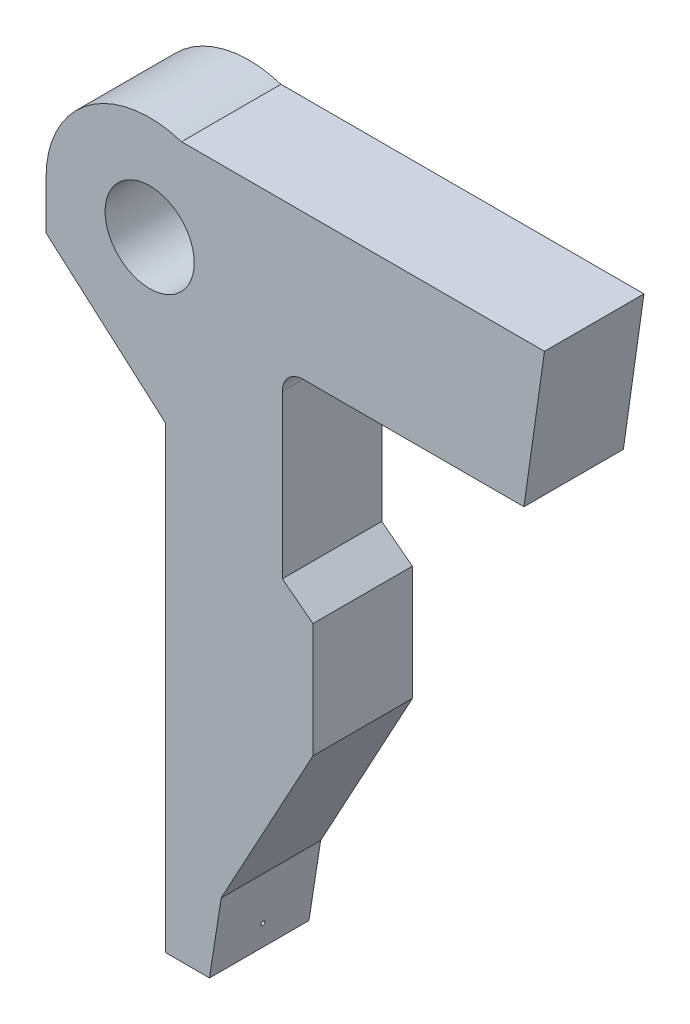
ISO-10303-21;
HEADER;
FILE_DESCRIPTION(('STEP AP214'),'2;1');
FILE_NAME('part.step','',(''),(''),'','','');
FILE_SCHEMA(('AUTOMOTIVE_DESIGN { 1 0 10303 214 1 1 1 1 }'));
ENDSEC;
DATA;
#1=APPLICATION_CONTEXT('core data for automotive mechanical design processes');
#2=APPLICATION_PROTOCOL_DEFINITION('international standard','automotive_design',2000,#1);
#3=PRODUCT_CONTEXT('',#1,'mechanical');
#4=PRODUCT('Part','Part','',(#3));
#5=PRODUCT_RELATED_PRODUCT_CATEGORY('part','',(#4));
#6=PRODUCT_DEFINITION_FORMATION('','',#4);
#7=PRODUCT_DEFINITION_CONTEXT('part definition',#1,'design');
#8=PRODUCT_DEFINITION('design','',#6,#7);
#9=PRODUCT_DEFINITION_SHAPE('','',#8);
#10=(LENGTH_UNIT() NAMED_UNIT(*) SI_UNIT(.MILLI.,.METRE.));
#11=(NAMED_UNIT(*) PLANE_ANGLE_UNIT() SI_UNIT($,.RADIAN.));
#12=(NAMED_UNIT(*) SI_UNIT($,.STERADIAN.) SOLID_ANGLE_UNIT());
#13=UNCERTAINTY_MEASURE_WITH_UNIT(LENGTH_MEASURE(1.E-05),#10,'distance_accuracy_value','');
#14=(GEOMETRIC_REPRESENTATION_CONTEXT(3) GLOBAL_UNCERTAINTY_ASSIGNED_CONTEXT((#13)) GLOBAL_UNIT_ASSIGNED_CONTEXT((#10,
#11,#12)) REPRESENTATION_CONTEXT('',''));
#15=CARTESIAN_POINT('',(0.,0.,0.));
#16=DIRECTION('',(0.,0.,1.));
#17=DIRECTION('',(1.,0.,0.));
#18=AXIS2_PLACEMENT_3D('',#15,#16,#17);
#19=CARTESIAN_POINT('',(6.40208237027269,0.,4.8));
#20=DIRECTION('',(-1.,0.,0.));
#21=DIRECTION('',(0.,-1.,0.));
#22=AXIS2_PLACEMENT_3D('',#19,#20,#21);
#23=PLANE('',#22);
#24=DIRECTION('',(0.,1.,0.));
#25=VECTOR('',#24,1.);
#26=CARTESIAN_POINT('',(6.40208237027269,0.,0.));
#27=LINE('',#26,#25);
#28=CARTESIAN_POINT('',(6.40208237027269,-11.0792552576076,0.));
#29=VERTEX_POINT('',#28);
#30=CARTESIAN_POINT('',(6.40208237027269,-3.2376102121532,0.));
#31=VERTEX_POINT('',#30);
#32=EDGE_CURVE('E171',#29,#31,#27,.T.);
#33=ORIENTED_EDGE('',*,*,#32,.T.);
#34=DIRECTION('',(0.,0.,-1.));
#35=VECTOR('',#34,1.);
#36=CARTESIAN_POINT('',(6.40208237027269,-3.2376102121532,4.8));
#37=LINE('',#36,#35);
#38=CARTESIAN_POINT('',(6.40208237027269,-3.2376102121532,4.8));
#39=VERTEX_POINT('',#38);
#40=EDGE_CURVE('E11',#39,#31,#37,.T.);
#41=ORIENTED_EDGE('',*,*,#40,.F.);
#42=DIRECTION('',(0.,1.,0.));
#43=VECTOR('',#42,1.);
#44=CARTESIAN_POINT('',(6.40208237027269,0.,4.8));
#45=LINE('',#44,#43);
#46=CARTESIAN_POINT('',(6.40208237027269,-11.0792552576076,4.8));
#47=VERTEX_POINT('',#46);
#48=EDGE_CURVE('E201',#47,#39,#45,.T.);
#49=ORIENTED_EDGE('',*,*,#48,.F.);
#50=DIRECTION('',(0.,0.,-1.));
#51=VECTOR('',#50,1.);
#52=CARTESIAN_POINT('',(6.40208237027269,-11.0792552576076,4.8));
#53=LINE('',#52,#51);
#54=EDGE_CURVE('E170',#47,#29,#53,.T.);
#55=ORIENTED_EDGE('',*,*,#54,.T.);
#56=EDGE_LOOP('',(#33,#41,#49,#55));
#57=FACE_BOUND('',#56,.T.);
#58=ADVANCED_FACE('F35',(#57),#23,.F.);
#59=CARTESIAN_POINT('',(7.40208237027269,-3.2376102121532,4.8));
#60=DIRECTION('',(0.,0.,-1.));
#61=DIRECTION('',(-1.,0.,0.));
#62=AXIS2_PLACEMENT_3D('',#59,#60,#61);
#63=CYLINDRICAL_SURFACE('',#62,0.999999999999999);
#64=CARTESIAN_POINT('',(7.40208237027269,-3.2376102121532,0.));
#65=DIRECTION('',(0.,0.,1.));
#66=DIRECTION('',(1.,0.,0.));
#67=AXIS2_PLACEMENT_3D('',#64,#65,#66);
#68=CIRCLE('',#67,0.999999999999999);
#69=CARTESIAN_POINT('',(7.40208237027269,-2.2376102121532,0.));
#70=VERTEX_POINT('',#69);
#71=EDGE_CURVE('E174',#31,#70,#68,.F.);
#72=ORIENTED_EDGE('',*,*,#71,.T.);
#73=DIRECTION('',(0.,0.,-1.));
#74=VECTOR('',#73,1.);
#75=CARTESIAN_POINT('',(7.40208237027269,-2.2376102121532,4.8));
#76=LINE('',#75,#74);
#77=CARTESIAN_POINT('',(7.40208237027269,-2.2376102121532,4.8));
#78=VERTEX_POINT('',#77);
#79=EDGE_CURVE('E43',#78,#70,#76,.T.);
#80=ORIENTED_EDGE('',*,*,#79,.F.);
#81=CARTESIAN_POINT('',(7.40208237027269,-3.2376102121532,4.8));
#82=DIRECTION('',(0.,0.,1.));
#83=DIRECTION('',(1.,0.,0.));
#84=AXIS2_PLACEMENT_3D('',#81,#82,#83);
#85=CIRCLE('',#84,0.999999999999999);
#86=EDGE_CURVE('E112',#39,#78,#85,.F.);
#87=ORIENTED_EDGE('',*,*,#86,.F.);
#88=ORIENTED_EDGE('',*,*,#40,.T.);
#89=EDGE_LOOP('',(#72,#80,#87,#88));
#90=FACE_BOUND('',#89,.T.);
#91=ADVANCED_FACE('F291',(#90),#63,.F.);
#92=CARTESIAN_POINT('',(0.,-2.2376102121532,4.8));
#93=DIRECTION('',(0.,1.,0.));
#94=DIRECTION('',(-1.,0.,0.));
#95=AXIS2_PLACEMENT_3D('',#92,#93,#94);
#96=PLANE('',#95);
#97=DIRECTION('',(1.,0.,0.));
#98=VECTOR('',#97,1.);
#99=CARTESIAN_POINT('',(0.,-2.2376102121532,0.));
#100=LINE('',#99,#98);
#101=CARTESIAN_POINT('',(18.063612226188,-2.2376102121532,0.));
#102=VERTEX_POINT('',#101);
#103=EDGE_CURVE('E177',#70,#102,#100,.T.);
#104=ORIENTED_EDGE('',*,*,#103,.T.);
#105=DIRECTION('',(0.,0.,-1.));
#106=VECTOR('',#105,1.);
#107=CARTESIAN_POINT('',(18.063612226188,-2.2376102121532,4.8));
#108=LINE('',#107,#106);
#109=CARTESIAN_POINT('',(18.063612226188,-2.2376102121532,4.8));
#110=VERTEX_POINT('',#109);
#111=EDGE_CURVE('E226',#110,#102,#108,.T.);
#112=ORIENTED_EDGE('',*,*,#111,.F.);
#113=DIRECTION('',(1.,0.,0.));
#114=VECTOR('',#113,1.);
#115=CARTESIAN_POINT('',(0.,-2.2376102121532,4.8));
#116=LINE('',#115,#114);
#117=EDGE_CURVE('E234',#78,#110,#116,.T.);
#118=ORIENTED_EDGE('',*,*,#117,.F.);
#119=ORIENTED_EDGE('',*,*,#79,.T.);
#120=EDGE_LOOP('',(#104,#112,#118,#119));
#121=FACE_BOUND('',#120,.T.);
#122=ADVANCED_FACE('F232',(#121),#96,.F.);
#123=CARTESIAN_POINT('',(18.0184346235268,-2.55607840833381,4.8));
#124=DIRECTION('',(-0.990087364863809,0.140452874434947,0.));
#125=DIRECTION('',(-0.140452874434947,-0.990087364863809,0.));
#126=AXIS2_PLACEMENT_3D('',#123,#124,#125);
#127=PLANE('',#126);
#128=DIRECTION('',(0.140452874434947,0.990087364863809,0.));
#129=VECTOR('',#128,1.);
#130=CARTESIAN_POINT('',(18.0184346235268,-2.55607840833381,0.));
#131=LINE('',#130,#129);
#132=CARTESIAN_POINT('',(19.0560025989645,4.7579971974597,0.));
#133=VERTEX_POINT('',#132);
#134=EDGE_CURVE('E179',#102,#133,#131,.T.);
#135=ORIENTED_EDGE('',*,*,#134,.T.);
#136=DIRECTION('',(0.,0.,-1.));
#137=VECTOR('',#136,1.);
#138=CARTESIAN_POINT('',(19.0560025989645,4.7579971974597,4.8));
#139=LINE('',#138,#137);
#140=CARTESIAN_POINT('',(19.0560025989645,4.7579971974597,4.8));
#141=VERTEX_POINT('',#140);
#142=EDGE_CURVE('E223',#141,#133,#139,.T.);
#143=ORIENTED_EDGE('',*,*,#142,.F.);
#144=DIRECTION('',(0.140452874434947,0.990087364863809,0.));
#145=VECTOR('',#144,1.);
#146=CARTESIAN_POINT('',(18.0184346235268,-2.55607840833381,4.8));
#147=LINE('',#146,#145);
#148=EDGE_CURVE('E253',#110,#141,#147,.T.);
#149=ORIENTED_EDGE('',*,*,#148,.F.);
#150=ORIENTED_EDGE('',*,*,#111,.T.);
#151=EDGE_LOOP('',(#135,#143,#149,#150));
#152=FACE_BOUND('',#151,.T.);
#153=ADVANCED_FACE('F244',(#152),#127,.F.);
#154=CARTESIAN_POINT('',(0.,4.7579971974597,4.8));
#155=DIRECTION('',(0.,-1.,0.));
#156=DIRECTION('',(0.,0.,-1.));
#157=AXIS2_PLACEMENT_3D('',#154,#155,#156);
#158=PLANE('',#157);
#159=DIRECTION('',(-1.,0.,0.));
#160=VECTOR('',#159,1.);
#161=CARTESIAN_POINT('',(0.,4.7579971974597,0.));
#162=LINE('',#161,#160);
#163=CARTESIAN_POINT('',(1.53670513403374,4.7579971974597,0.));
#164=VERTEX_POINT('',#163);
#165=EDGE_CURVE('E181',#133,#164,#162,.T.);
#166=ORIENTED_EDGE('',*,*,#165,.T.);
#167=DIRECTION('',(0.,0.,-1.));
#168=VECTOR('',#167,1.);
#169=CARTESIAN_POINT('',(1.53670513403374,4.7579971974597,4.8));
#170=LINE('',#169,#168);
#171=CARTESIAN_POINT('',(1.53670513403374,4.7579971974597,4.8));
#172=VERTEX_POINT('',#171);
#173=EDGE_CURVE('E220',#172,#164,#170,.T.);
#174=ORIENTED_EDGE('',*,*,#173,.F.);
#175=DIRECTION('',(-1.,0.,0.));
#176=VECTOR('',#175,1.);
#177=CARTESIAN_POINT('',(0.,4.7579971974597,4.8));
#178=LINE('',#177,#176);
#179=EDGE_CURVE('E250',#141,#172,#178,.T.);
#180=ORIENTED_EDGE('',*,*,#179,.F.);
#181=ORIENTED_EDGE('',*,*,#142,.T.);
#182=EDGE_LOOP('',(#166,#174,#180,#181));
#183=FACE_BOUND('',#182,.T.);
#184=ADVANCED_FACE('F248',(#183),#158,.F.);
#185=CARTESIAN_POINT('',(0.,0.,4.8));
#186=DIRECTION('',(0.,0.,-1.));
#187=DIRECTION('',(-1.,0.,0.));
#188=AXIS2_PLACEMENT_3D('',#185,#186,#187);
#189=CYLINDRICAL_SURFACE('',#188,5.);
#190=CARTESIAN_POINT('',(0.,0.,0.));
#191=DIRECTION('',(0.,0.,1.));
#192=DIRECTION('',(1.,0.,0.));
#193=AXIS2_PLACEMENT_3D('',#190,#191,#192);
#194=CIRCLE('',#193,5.);
#195=CARTESIAN_POINT('',(-5.,0.,0.));
#196=VERTEX_POINT('',#195);
#197=EDGE_CURVE('E183',#164,#196,#194,.T.);
#198=ORIENTED_EDGE('',*,*,#197,.T.);
#199=DIRECTION('',(0.,0.,-1.));
#200=VECTOR('',#199,1.);
#201=CARTESIAN_POINT('',(-5.,0.,4.8));
#202=LINE('',#201,#200);
#203=CARTESIAN_POINT('',(-5.,0.,4.8));
#204=VERTEX_POINT('',#203);
#205=EDGE_CURVE('E217',#204,#196,#202,.T.);
#206=ORIENTED_EDGE('',*,*,#205,.F.);
#207=CARTESIAN_POINT('',(0.,0.,4.8));
#208=DIRECTION('',(0.,0.,1.));
#209=DIRECTION('',(1.,0.,0.));
#210=AXIS2_PLACEMENT_3D('',#207,#208,#209);
#211=CIRCLE('',#210,5.);
#212=EDGE_CURVE('E252',#172,#204,#211,.T.);
#213=ORIENTED_EDGE('',*,*,#212,.F.);
#214=ORIENTED_EDGE('',*,*,#173,.T.);
#215=EDGE_LOOP('',(#198,#206,#213,#214));
#216=FACE_BOUND('',#215,.T.);
#217=ADVANCED_FACE('F304',(#216),#189,.T.);
#218=CARTESIAN_POINT('',(-5.,0.,4.8));
#219=DIRECTION('',(1.,0.,0.));
#220=DIRECTION('',(0.,0.,-1.));
#221=AXIS2_PLACEMENT_3D('',#218,#219,#220);
#222=PLANE('',#221);
#223=DIRECTION('',(0.,-1.,0.));
#224=VECTOR('',#223,1.);
#225=CARTESIAN_POINT('',(-5.,0.,0.));
#226=LINE('',#225,#224);
#227=CARTESIAN_POINT('',(-5.,-2.32647439688253,0.));
#228=VERTEX_POINT('',#227);
#229=EDGE_CURVE('E185',#196,#228,#226,.T.);
#230=ORIENTED_EDGE('',*,*,#229,.T.);
#231=DIRECTION('',(0.,0.,-1.));
#232=VECTOR('',#231,1.);
#233=CARTESIAN_POINT('',(-5.,-2.32647439688253,4.8));
#234=LINE('',#233,#232);
#235=CARTESIAN_POINT('',(-5.,-2.32647439688253,4.8));
#236=VERTEX_POINT('',#235);
#237=EDGE_CURVE('E214',#236,#228,#234,.T.);
#238=ORIENTED_EDGE('',*,*,#237,.F.);
#239=DIRECTION('',(0.,-1.,0.));
#240=VECTOR('',#239,1.);
#241=CARTESIAN_POINT('',(-5.,0.,4.8));
#242=LINE('',#241,#240);
#243=EDGE_CURVE('E255',#204,#236,#242,.T.);
#244=ORIENTED_EDGE('',*,*,#243,.F.);
#245=ORIENTED_EDGE('',*,*,#205,.T.);
#246=EDGE_LOOP('',(#230,#238,#244,#245));
#247=FACE_BOUND('',#246,.T.);
#248=ADVANCED_FACE('F307',(#247),#222,.F.);
#249=CARTESIAN_POINT('',(-3.32960365921922,-3.79285286398016,4.8));
#250=DIRECTION('',(0.659722162079872,0.751509593325767,0.));
#251=DIRECTION('',(-0.751509593325767,0.659722162079872,0.));
#252=AXIS2_PLACEMENT_3D('',#249,#250,#251);
#253=PLANE('',#252);
#254=DIRECTION('',(0.751509593325767,-0.659722162079872,0.));
#255=VECTOR('',#254,1.);
#256=CARTESIAN_POINT('',(-3.32960365921922,-3.79285286398016,0.));
#257=LINE('',#256,#255);
#258=CARTESIAN_POINT('',(0.754164722411706,-7.3778403745722,0.));
#259=VERTEX_POINT('',#258);
#260=EDGE_CURVE('E187',#228,#259,#257,.T.);
#261=ORIENTED_EDGE('',*,*,#260,.T.);
#262=DIRECTION('',(0.,0.,-1.));
#263=VECTOR('',#262,1.);
#264=CARTESIAN_POINT('',(0.754164722411706,-7.3778403745722,4.8));
#265=LINE('',#264,#263);
#266=CARTESIAN_POINT('',(0.754164722411706,-7.3778403745722,4.8));
#267=VERTEX_POINT('',#266);
#268=EDGE_CURVE('E211',#267,#259,#265,.T.);
#269=ORIENTED_EDGE('',*,*,#268,.F.);
#270=DIRECTION('',(0.751509593325767,-0.659722162079872,0.));
#271=VECTOR('',#270,1.);
#272=CARTESIAN_POINT('',(-3.32960365921922,-3.79285286398016,4.8));
#273=LINE('',#272,#271);
#274=EDGE_CURVE('E261',#236,#267,#273,.T.);
#275=ORIENTED_EDGE('',*,*,#274,.F.);
#276=ORIENTED_EDGE('',*,*,#237,.T.);
#277=EDGE_LOOP('',(#261,#269,#275,#276));
#278=FACE_BOUND('',#277,.T.);
#279=ADVANCED_FACE('F311',(#278),#253,.F.);
#280=CARTESIAN_POINT('',(0.754164722411706,0.,4.8));
#281=DIRECTION('',(1.,0.,0.));
#282=DIRECTION('',(0.,0.,-1.));
#283=AXIS2_PLACEMENT_3D('',#280,#281,#282);
#284=PLANE('',#283);
#285=CARTESIAN_POINT('',(0.754164722411706,-27.0198901160511,2.4));
#286=DIRECTION('',(-1.,0.,0.));
#287=DIRECTION('',(0.,0.,1.));
#288=AXIS2_PLACEMENT_3D('',#285,#286,#287);
#289=CIRCLE('',#288,1.825);
#290=CARTESIAN_POINT('',(0.754164722411706,-27.0198901160511,4.225));
#291=VERTEX_POINT('',#290);
#292=EDGE_CURVE('E416',#291,#291,#289,.T.);
#293=ORIENTED_EDGE('',*,*,#292,.F.);
#294=EDGE_LOOP('',(#293));
#295=FACE_BOUND('',#294,.T.);
#296=DIRECTION('',(0.,-1.,0.));
#297=VECTOR('',#296,1.);
#298=CARTESIAN_POINT('',(0.754164722411706,0.,0.));
#299=LINE('',#298,#297);
#300=CARTESIAN_POINT('',(0.754164722411706,-29.5198901160511,0.));
#301=VERTEX_POINT('',#300);
#302=EDGE_CURVE('E189',#259,#301,#299,.T.);
#303=ORIENTED_EDGE('',*,*,#302,.T.);
#304=DIRECTION('',(0.,0.,-1.));
#305=VECTOR('',#304,1.);
#306=CARTESIAN_POINT('',(0.754164722411706,-29.5198901160511,4.8));
#307=LINE('',#306,#305);
#308=CARTESIAN_POINT('',(0.754164722411706,-29.5198901160511,4.8));
#309=VERTEX_POINT('',#308);
#310=EDGE_CURVE('E208',#309,#301,#307,.T.);
#311=ORIENTED_EDGE('',*,*,#310,.F.);
#312=DIRECTION('',(0.,-1.,0.));
#313=VECTOR('',#312,1.);
#314=CARTESIAN_POINT('',(0.754164722411706,0.,4.8));
#315=LINE('',#314,#313);
#316=EDGE_CURVE('E263',#267,#309,#315,.T.);
#317=ORIENTED_EDGE('',*,*,#316,.F.);
#318=ORIENTED_EDGE('',*,*,#268,.T.);
#319=EDGE_LOOP('',(#303,#311,#317,#318));
#320=FACE_BOUND('',#319,.T.);
#321=ADVANCED_FACE('F315',(#295,#320),#284,.F.);
#322=CARTESIAN_POINT('',(-2.39866646747301E-13,-29.519890116051,4.8));
#323=DIRECTION('',(0.,1.,0.));
#324=DIRECTION('',(-1.,0.,0.));
#325=AXIS2_PLACEMENT_3D('',#322,#323,#324);
#326=PLANE('',#325);
#327=DIRECTION('',(1.,0.,0.));
#328=VECTOR('',#327,1.);
#329=CARTESIAN_POINT('',(-2.39866646747301E-13,-29.519890116051,0.));
#330=LINE('',#329,#328);
#331=CARTESIAN_POINT('',(2.88905288160283,-29.5198901160511,0.));
#332=VERTEX_POINT('',#331);
#333=EDGE_CURVE('E191',#301,#332,#330,.T.);
#334=ORIENTED_EDGE('',*,*,#333,.T.);
#335=DIRECTION('',(0.,0.,-1.));
#336=VECTOR('',#335,1.);
#337=CARTESIAN_POINT('',(2.88905288160283,-29.5198901160511,4.8));
#338=LINE('',#337,#336);
#339=CARTESIAN_POINT('',(2.88905288160283,-29.5198901160511,4.8));
#340=VERTEX_POINT('',#339);
#341=EDGE_CURVE('E205',#340,#332,#338,.T.);
#342=ORIENTED_EDGE('',*,*,#341,.F.);
#343=DIRECTION('',(1.,0.,0.));
#344=VECTOR('',#343,1.);
#345=CARTESIAN_POINT('',(-2.39866646747301E-13,-29.519890116051,4.8));
#346=LINE('',#345,#344);
#347=EDGE_CURVE('E265',#309,#340,#346,.T.);
#348=ORIENTED_EDGE('',*,*,#347,.F.);
#349=ORIENTED_EDGE('',*,*,#310,.T.);
#350=EDGE_LOOP('',(#334,#342,#348,#349));
#351=FACE_BOUND('',#350,.T.);
#352=ADVANCED_FACE('F271',(#351),#326,.F.);
#353=CARTESIAN_POINT('',(7.29737212162931,-1.13324948681235,4.8));
#354=DIRECTION('',(-0.988155457698499,0.153456154717463,0.));
#355=DIRECTION('',(-0.153456154717463,-0.988155457698499,0.));
#356=AXIS2_PLACEMENT_3D('',#353,#354,#355);
#357=PLANE('',#356);
#358=CARTESIAN_POINT('',(3.07152516406432,-28.3448901160511,2.4));
#359=DIRECTION('',(-0.988155457698499,0.153456154717463,0.));
#360=DIRECTION('',(-0.153456154717463,-0.988155457698499,0.));
#361=AXIS2_PLACEMENT_3D('',#358,#359,#360);
#362=ELLIPSE('',#361,0.101198651711046,0.0999999999999997);
#363=CARTESIAN_POINT('',(3.05599560811015,-28.4448901160511,2.4));
#364=VERTEX_POINT('',#363);
#365=EDGE_CURVE('E415',#364,#364,#362,.F.);
#366=ORIENTED_EDGE('',*,*,#365,.F.);
#367=EDGE_LOOP('',(#366));
#368=FACE_BOUND('',#367,.T.);
#369=DIRECTION('',(0.153456154717463,0.988155457698499,0.));
#370=VECTOR('',#369,1.);
#371=CARTESIAN_POINT('',(7.29737212162931,-1.13324948681235,0.));
#372=LINE('',#371,#370);
#373=CARTESIAN_POINT('',(3.45262694445621,-25.8908484067027,0.));
#374=VERTEX_POINT('',#373);
#375=EDGE_CURVE('E193',#332,#374,#372,.T.);
#376=ORIENTED_EDGE('',*,*,#375,.T.);
#377=DIRECTION('',(0.,0.,-1.));
#378=VECTOR('',#377,1.);
#379=CARTESIAN_POINT('',(3.45262694445621,-25.8908484067027,4.8));
#380=LINE('',#379,#378);
#381=CARTESIAN_POINT('',(3.45262694445621,-25.8908484067027,4.8));
#382=VERTEX_POINT('',#381);
#383=EDGE_CURVE('E159',#382,#374,#380,.T.);
#384=ORIENTED_EDGE('',*,*,#383,.F.);
#385=DIRECTION('',(0.153456154717463,0.988155457698499,0.));
#386=VECTOR('',#385,1.);
#387=CARTESIAN_POINT('',(7.29737212162931,-1.13324948681235,4.8));
#388=LINE('',#387,#386);
#389=EDGE_CURVE('E150',#340,#382,#388,.T.);
#390=ORIENTED_EDGE('',*,*,#389,.F.);
#391=ORIENTED_EDGE('',*,*,#341,.T.);
#392=EDGE_LOOP('',(#376,#384,#390,#391));
#393=FACE_BOUND('',#392,.T.);
#394=ADVANCED_FACE('F275',(#368,#393),#357,.F.);
#395=CARTESIAN_POINT('',(13.5263332156528,-7.34866620752027,4.8));
#396=DIRECTION('',(-0.878695413301182,0.477382834466704,0.));
#397=DIRECTION('',(-0.477382834466704,-0.878695413301182,0.));
#398=AXIS2_PLACEMENT_3D('',#395,#396,#397);
#399=PLANE('',#398);
#400=DIRECTION('',(0.477382834466704,0.878695413301182,0.));
#401=VECTOR('',#400,1.);
#402=CARTESIAN_POINT('',(13.5263332156528,-7.34866620752027,0.));
#403=LINE('',#402,#401);
#404=CARTESIAN_POINT('',(7.88035743742888,-17.7409397912093,0.));
#405=VERTEX_POINT('',#404);
#406=EDGE_CURVE('E158',#374,#405,#403,.T.);
#407=ORIENTED_EDGE('',*,*,#406,.T.);
#408=DIRECTION('',(0.,0.,-1.));
#409=VECTOR('',#408,1.);
#410=CARTESIAN_POINT('',(7.88035743742888,-17.7409397912093,4.8));
#411=LINE('',#410,#409);
#412=CARTESIAN_POINT('',(7.88035743742888,-17.7409397912093,4.8));
#413=VERTEX_POINT('',#412);
#414=EDGE_CURVE('E155',#413,#405,#411,.T.);
#415=ORIENTED_EDGE('',*,*,#414,.F.);
#416=DIRECTION('',(0.477382834466704,0.878695413301182,0.));
#417=VECTOR('',#416,1.);
#418=CARTESIAN_POINT('',(13.5263332156528,-7.34866620752027,4.8));
#419=LINE('',#418,#417);
#420=EDGE_CURVE('E143',#382,#413,#419,.T.);
#421=ORIENTED_EDGE('',*,*,#420,.F.);
#422=ORIENTED_EDGE('',*,*,#383,.T.);
#423=EDGE_LOOP('',(#407,#415,#421,#422));
#424=FACE_BOUND('',#423,.T.);
#425=ADVANCED_FACE('F156',(#424),#399,.F.);
#426=CARTESIAN_POINT('',(7.88035743742888,0.,4.8));
#427=DIRECTION('',(-1.,0.,0.));
#428=DIRECTION('',(0.,0.,1.));
#429=AXIS2_PLACEMENT_3D('',#426,#427,#428);
#430=PLANE('',#429);
#431=DIRECTION('',(0.,1.,0.));
#432=VECTOR('',#431,1.);
#433=CARTESIAN_POINT('',(7.88035743742888,0.,0.));
#434=LINE('',#433,#432);
#435=CARTESIAN_POINT('',(7.88035743742888,-12.211059605899,0.));
#436=VERTEX_POINT('',#435);
#437=EDGE_CURVE('E98',#405,#436,#434,.T.);
#438=ORIENTED_EDGE('',*,*,#437,.T.);
#439=DIRECTION('',(0.,0.,-1.));
#440=VECTOR('',#439,1.);
#441=CARTESIAN_POINT('',(7.88035743742888,-12.211059605899,4.8));
#442=LINE('',#441,#440);
#443=CARTESIAN_POINT('',(7.88035743742888,-12.211059605899,4.8));
#444=VERTEX_POINT('',#443);
#445=EDGE_CURVE('E160',#444,#436,#442,.T.);
#446=ORIENTED_EDGE('',*,*,#445,.F.);
#447=DIRECTION('',(0.,1.,0.));
#448=VECTOR('',#447,1.);
#449=CARTESIAN_POINT('',(7.88035743742888,0.,4.8));
#450=LINE('',#449,#448);
#451=EDGE_CURVE('E148',#413,#444,#450,.T.);
#452=ORIENTED_EDGE('',*,*,#451,.F.);
#453=ORIENTED_EDGE('',*,*,#414,.T.);
#454=EDGE_LOOP('',(#438,#446,#452,#453));
#455=FACE_BOUND('',#454,.T.);
#456=ADVANCED_FACE('F162',(#455),#430,.F.);
#457=CARTESIAN_POINT('',(-2.98186004568765,-3.89467434538796,4.8));
#458=DIRECTION('',(-0.607910502716912,-0.794005554569029,0.));
#459=DIRECTION('',(0.794005554569029,-0.607910502716912,0.));
#460=AXIS2_PLACEMENT_3D('',#457,#458,#459);
#461=PLANE('',#460);
#462=DIRECTION('',(-0.794005554569029,0.607910502716912,0.));
#463=VECTOR('',#462,1.);
#464=CARTESIAN_POINT('',(-2.98186004568765,-3.89467434538796,0.));
#465=LINE('',#464,#463);
#466=EDGE_CURVE('E104',#436,#29,#465,.T.);
#467=ORIENTED_EDGE('',*,*,#466,.T.);
#468=ORIENTED_EDGE('',*,*,#54,.F.);
#469=DIRECTION('',(-0.794005554569029,0.607910502716912,0.));
#470=VECTOR('',#469,1.);
#471=CARTESIAN_POINT('',(-2.98186004568765,-3.89467434538796,4.8));
#472=LINE('',#471,#470);
#473=EDGE_CURVE('E51',#444,#47,#472,.T.);
#474=ORIENTED_EDGE('',*,*,#473,.F.);
#475=ORIENTED_EDGE('',*,*,#445,.T.);
#476=EDGE_LOOP('',(#467,#468,#474,#475));
#477=FACE_BOUND('',#476,.T.);
#478=ADVANCED_FACE('F279',(#477),#461,.F.);
#479=CARTESIAN_POINT('',(0.,0.,4.8));
#480=DIRECTION('',(0.,0.,-1.));
#481=DIRECTION('',(-1.,0.,0.));
#482=AXIS2_PLACEMENT_3D('',#479,#480,#481);
#483=CYLINDRICAL_SURFACE('',#482,2.15);
#484=CARTESIAN_POINT('',(0.,0.,4.8));
#485=DIRECTION('',(0.,0.,1.));
#486=DIRECTION('',(1.,0.,0.));
#487=AXIS2_PLACEMENT_3D('',#484,#485,#486);
#488=CIRCLE('',#487,2.15);
#489=CARTESIAN_POINT('',(2.15,0.,4.8));
#490=VERTEX_POINT('',#489);
#491=EDGE_CURVE('E164',#490,#490,#488,.T.);
#492=ORIENTED_EDGE('',*,*,#491,.T.);
#493=EDGE_LOOP('',(#492));
#494=FACE_BOUND('',#493,.T.);
#495=CARTESIAN_POINT('',(0.,0.,0.));
#496=DIRECTION('',(0.,0.,1.));
#497=DIRECTION('',(1.,0.,0.));
#498=AXIS2_PLACEMENT_3D('',#495,#496,#497);
#499=CIRCLE('',#498,2.15);
#500=CARTESIAN_POINT('',(2.15,0.,0.));
#501=VERTEX_POINT('',#500);
#502=EDGE_CURVE('E198',#501,#501,#499,.T.);
#503=ORIENTED_EDGE('',*,*,#502,.F.);
#504=EDGE_LOOP('',(#503));
#505=FACE_BOUND('',#504,.T.);
#506=ADVANCED_FACE('F281',(#494,#505),#483,.F.);
#507=CARTESIAN_POINT('',(0.,0.,4.8));
#508=DIRECTION('',(0.,0.,1.));
#509=DIRECTION('',(1.,0.,0.));
#510=AXIS2_PLACEMENT_3D('',#507,#508,#509);
#511=PLANE('',#510);
#512=ORIENTED_EDGE('',*,*,#48,.T.);
#513=ORIENTED_EDGE('',*,*,#86,.T.);
#514=ORIENTED_EDGE('',*,*,#117,.T.);
#515=ORIENTED_EDGE('',*,*,#148,.T.);
#516=ORIENTED_EDGE('',*,*,#179,.T.);
#517=ORIENTED_EDGE('',*,*,#212,.T.);
#518=ORIENTED_EDGE('',*,*,#243,.T.);
#519=ORIENTED_EDGE('',*,*,#274,.T.);
#520=ORIENTED_EDGE('',*,*,#316,.T.);
#521=ORIENTED_EDGE('',*,*,#347,.T.);
#522=ORIENTED_EDGE('',*,*,#389,.T.);
#523=ORIENTED_EDGE('',*,*,#420,.T.);
#524=ORIENTED_EDGE('',*,*,#451,.T.);
#525=ORIENTED_EDGE('',*,*,#473,.T.);
#526=EDGE_LOOP('',(#512,#513,#514,#515,#516,#517,#518,#519,#520,#521,#522,#523,#524,#525));
#527=FACE_BOUND('',#526,.T.);
#528=ORIENTED_EDGE('',*,*,#491,.F.);
#529=EDGE_LOOP('',(#528));
#530=FACE_BOUND('',#529,.T.);
#531=ADVANCED_FACE('F145',(#527,#530),#511,.T.);
#532=CARTESIAN_POINT('',(0.,0.,0.));
#533=DIRECTION('',(0.,0.,1.));
#534=DIRECTION('',(1.,0.,0.));
#535=AXIS2_PLACEMENT_3D('',#532,#533,#534);
#536=PLANE('',#535);
#537=ORIENTED_EDGE('',*,*,#32,.F.);
#538=ORIENTED_EDGE('',*,*,#466,.F.);
#539=ORIENTED_EDGE('',*,*,#437,.F.);
#540=ORIENTED_EDGE('',*,*,#406,.F.);
#541=ORIENTED_EDGE('',*,*,#375,.F.);
#542=ORIENTED_EDGE('',*,*,#333,.F.);
#543=ORIENTED_EDGE('',*,*,#302,.F.);
#544=ORIENTED_EDGE('',*,*,#260,.F.);
#545=ORIENTED_EDGE('',*,*,#229,.F.);
#546=ORIENTED_EDGE('',*,*,#197,.F.);
#547=ORIENTED_EDGE('',*,*,#165,.F.);
#548=ORIENTED_EDGE('',*,*,#134,.F.);
#549=ORIENTED_EDGE('',*,*,#103,.F.);
#550=ORIENTED_EDGE('',*,*,#71,.F.);
#551=EDGE_LOOP('',(#537,#538,#539,#540,#541,#542,#543,#544,#545,#546,#547,#548,#549,#550));
#552=FACE_BOUND('',#551,.T.);
#553=ORIENTED_EDGE('',*,*,#502,.T.);
#554=EDGE_LOOP('',(#553));
#555=FACE_BOUND('',#554,.T.);
#556=ADVANCED_FACE('F238',(#552,#555),#536,.F.);
#557=CARTESIAN_POINT('',(2.55416472241171,-27.0198901160511,2.4));
#558=DIRECTION('',(-1.,0.,0.));
#559=DIRECTION('',(0.,0.,1.));
#560=AXIS2_PLACEMENT_3D('',#557,#558,#559);
#561=CYLINDRICAL_SURFACE('',#560,1.825);
#562=CARTESIAN_POINT('',(2.55416472241171,-27.0198901160511,2.4));
#563=DIRECTION('',(-1.,0.,0.));
#564=DIRECTION('',(0.,0.,1.));
#565=AXIS2_PLACEMENT_3D('',#562,#563,#564);
#566=CIRCLE('',#565,1.825);
#567=CARTESIAN_POINT('',(2.55416472241171,-27.0198901160511,4.225));
#568=VERTEX_POINT('',#567);
#569=EDGE_CURVE('E175',#568,#568,#566,.T.);
#570=ORIENTED_EDGE('',*,*,#569,.F.);
#571=EDGE_LOOP('',(#570));
#572=FACE_BOUND('',#571,.T.);
#573=ORIENTED_EDGE('',*,*,#292,.T.);
#574=EDGE_LOOP('',(#573));
#575=FACE_BOUND('',#574,.T.);
#576=ADVANCED_FACE('F364',(#572,#575),#561,.F.);
#577=CARTESIAN_POINT('',(2.55416472241171,-27.0198901160511,2.4));
#578=DIRECTION('',(-1.,0.,0.));
#579=DIRECTION('',(0.,0.,1.));
#580=AXIS2_PLACEMENT_3D('',#577,#578,#579);
#581=PLANE('',#580);
#582=CARTESIAN_POINT('',(2.55416472241171,-28.3448901160511,2.4));
#583=DIRECTION('',(-1.,0.,0.));
#584=DIRECTION('',(0.,0.,1.));
#585=AXIS2_PLACEMENT_3D('',#582,#583,#584);
#586=CIRCLE('',#585,0.0999999999999997);
#587=CARTESIAN_POINT('',(2.55416472241171,-28.3448901160511,2.5));
#588=VERTEX_POINT('',#587);
#589=EDGE_CURVE('E412',#588,#588,#586,.T.);
#590=ORIENTED_EDGE('',*,*,#589,.F.);
#591=EDGE_LOOP('',(#590));
#592=FACE_BOUND('',#591,.T.);
#593=ORIENTED_EDGE('',*,*,#569,.T.);
#594=EDGE_LOOP('',(#593));
#595=FACE_BOUND('',#594,.T.);
#596=ADVANCED_FACE('F380',(#592,#595),#581,.T.);
#597=CARTESIAN_POINT('',(19.0570025989645,-28.3448901160511,2.4));
#598=DIRECTION('',(-1.,0.,0.));
#599=DIRECTION('',(0.,0.,1.));
#600=AXIS2_PLACEMENT_3D('',#597,#598,#599);
#601=CYLINDRICAL_SURFACE('',#600,0.0999999999999997);
#602=ORIENTED_EDGE('',*,*,#589,.T.);
#603=EDGE_LOOP('',(#602));
#604=FACE_BOUND('',#603,.T.);
#605=ORIENTED_EDGE('',*,*,#365,.T.);
#606=EDGE_LOOP('',(#605));
#607=FACE_BOUND('',#606,.T.);
#608=ADVANCED_FACE('F395',(#604,#607),#601,.F.);
#609=CLOSED_SHELL('',(#58,#91,#122,#153,#184,#217,#248,#279,#321,#352,#394,#425,#456,#478,#506,
#531,#556,#576,#596,#608));
#610=MANIFOLD_SOLID_BREP('B2',#609);
#611=ADVANCED_BREP_SHAPE_REPRESENTATION('',(#18,#610),#14);
#612=SHAPE_DEFINITION_REPRESENTATION(#9,#611);
ENDSEC;
END-ISO-10303-21;
